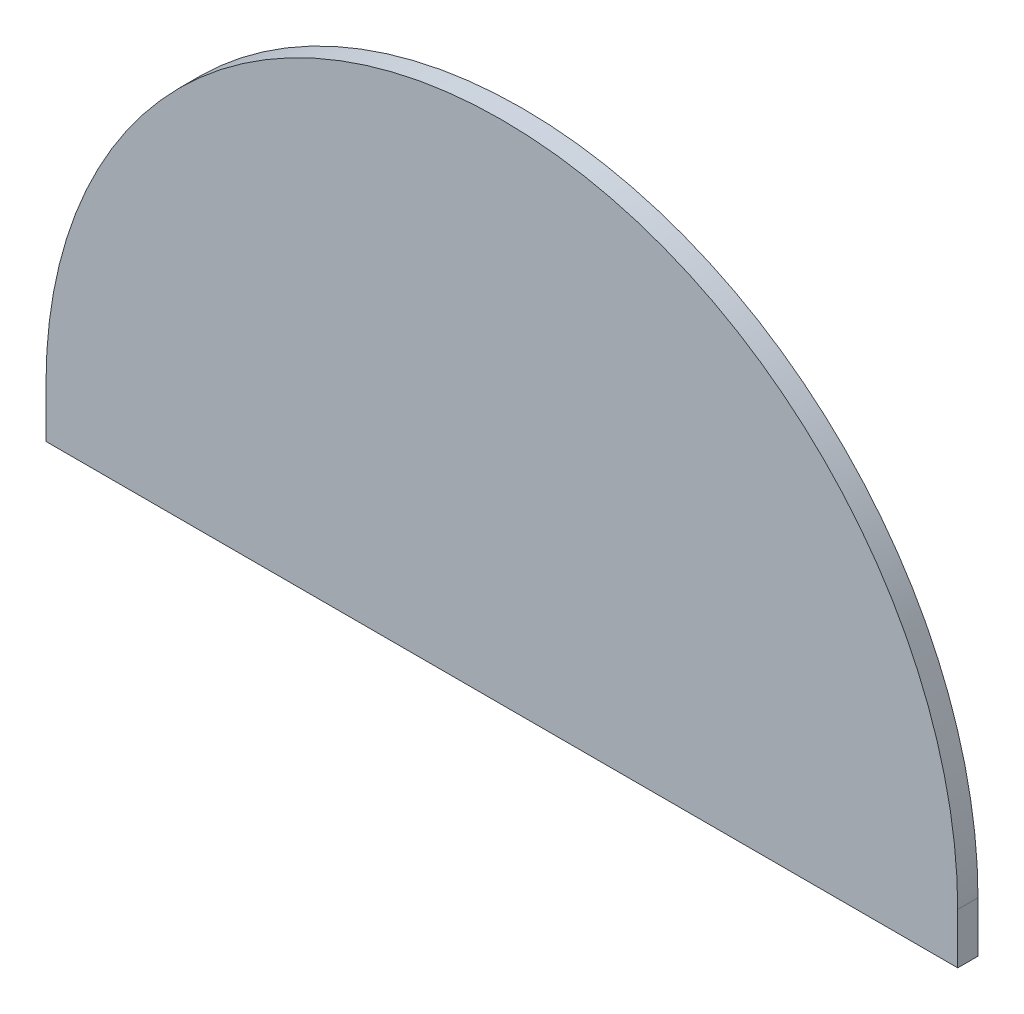
ISO-10303-21;
HEADER;
FILE_DESCRIPTION(('STEP AP214'),'2;1');
FILE_NAME('part.step','',(''),(''),'','','');
FILE_SCHEMA(('AUTOMOTIVE_DESIGN { 1 0 10303 214 1 1 1 1 }'));
ENDSEC;
DATA;
#1=APPLICATION_CONTEXT('core data for automotive mechanical design processes');
#2=APPLICATION_PROTOCOL_DEFINITION('international standard','automotive_design',2000,#1);
#3=PRODUCT_CONTEXT('',#1,'mechanical');
#4=PRODUCT('Part','Part','',(#3));
#5=PRODUCT_RELATED_PRODUCT_CATEGORY('part','',(#4));
#6=PRODUCT_DEFINITION_FORMATION('','',#4);
#7=PRODUCT_DEFINITION_CONTEXT('part definition',#1,'design');
#8=PRODUCT_DEFINITION('design','',#6,#7);
#9=PRODUCT_DEFINITION_SHAPE('','',#8);
#10=(LENGTH_UNIT() NAMED_UNIT(*) SI_UNIT(.MILLI.,.METRE.));
#11=(NAMED_UNIT(*) PLANE_ANGLE_UNIT() SI_UNIT($,.RADIAN.));
#12=(NAMED_UNIT(*) SI_UNIT($,.STERADIAN.) SOLID_ANGLE_UNIT());
#13=UNCERTAINTY_MEASURE_WITH_UNIT(LENGTH_MEASURE(1.E-05),#10,'distance_accuracy_value','');
#14=(GEOMETRIC_REPRESENTATION_CONTEXT(3) GLOBAL_UNCERTAINTY_ASSIGNED_CONTEXT((#13)) GLOBAL_UNIT_ASSIGNED_CONTEXT((#10,
#11,#12)) REPRESENTATION_CONTEXT('',''));
#15=CARTESIAN_POINT('',(0.,0.,0.));
#16=DIRECTION('',(0.,0.,1.));
#17=DIRECTION('',(1.,0.,0.));
#18=AXIS2_PLACEMENT_3D('',#15,#16,#17);
#19=CARTESIAN_POINT('',(0.,0.,2.));
#20=DIRECTION('',(0.,0.,-1.));
#21=DIRECTION('',(-1.,0.,0.));
#22=AXIS2_PLACEMENT_3D('',#19,#20,#21);
#23=CYLINDRICAL_SURFACE('',#22,45.);
#24=CARTESIAN_POINT('',(0.,0.,0.));
#25=DIRECTION('',(0.,0.,1.));
#26=DIRECTION('',(-1.,0.,0.));
#27=AXIS2_PLACEMENT_3D('',#24,#25,#26);
#28=CIRCLE('',#27,45.);
#29=CARTESIAN_POINT('',(45.,0.,0.));
#30=VERTEX_POINT('',#29);
#31=CARTESIAN_POINT('',(-45.,0.,0.));
#32=VERTEX_POINT('',#31);
#33=EDGE_CURVE('E89',#30,#32,#28,.T.);
#34=ORIENTED_EDGE('',*,*,#33,.T.);
#35=DIRECTION('',(0.,0.,-1.));
#36=VECTOR('',#35,1.);
#37=CARTESIAN_POINT('',(-45.,0.,2.));
#38=LINE('',#37,#36);
#39=CARTESIAN_POINT('',(-45.,0.,2.));
#40=VERTEX_POINT('',#39);
#41=EDGE_CURVE('E11',#40,#32,#38,.T.);
#42=ORIENTED_EDGE('',*,*,#41,.F.);
#43=CARTESIAN_POINT('',(0.,0.,2.));
#44=DIRECTION('',(0.,0.,1.));
#45=DIRECTION('',(-1.,0.,0.));
#46=AXIS2_PLACEMENT_3D('',#43,#44,#45);
#47=CIRCLE('',#46,45.);
#48=CARTESIAN_POINT('',(45.,0.,2.));
#49=VERTEX_POINT('',#48);
#50=EDGE_CURVE('E47',#49,#40,#47,.T.);
#51=ORIENTED_EDGE('',*,*,#50,.F.);
#52=DIRECTION('',(0.,0.,-1.));
#53=VECTOR('',#52,1.);
#54=CARTESIAN_POINT('',(45.,0.,2.));
#55=LINE('',#54,#53);
#56=EDGE_CURVE('E40',#49,#30,#55,.T.);
#57=ORIENTED_EDGE('',*,*,#56,.T.);
#58=EDGE_LOOP('',(#34,#42,#51,#57));
#59=FACE_BOUND('',#58,.T.);
#60=ADVANCED_FACE('F32',(#59),#23,.T.);
#61=CARTESIAN_POINT('',(0.,0.,2.));
#62=DIRECTION('',(0.,0.,-1.));
#63=DIRECTION('',(-1.,0.,0.));
#64=AXIS2_PLACEMENT_3D('',#61,#62,#63);
#65=PLANE('',#64);
#66=ORIENTED_EDGE('',*,*,#50,.T.);
#67=DIRECTION('',(0.,1.,0.));
#68=VECTOR('',#67,1.);
#69=CARTESIAN_POINT('',(-45.,-5.,1.99999999999999));
#70=LINE('',#69,#68);
#71=CARTESIAN_POINT('',(-45.,-5.,1.99999999999999));
#72=VERTEX_POINT('',#71);
#73=EDGE_CURVE('E74',#72,#40,#70,.T.);
#74=ORIENTED_EDGE('',*,*,#73,.F.);
#75=DIRECTION('',(-1.,0.,0.));
#76=VECTOR('',#75,1.);
#77=CARTESIAN_POINT('',(45.,-5.,2.));
#78=LINE('',#77,#76);
#79=CARTESIAN_POINT('',(45.,-5.,2.));
#80=VERTEX_POINT('',#79);
#81=EDGE_CURVE('E67',#80,#72,#78,.T.);
#82=ORIENTED_EDGE('',*,*,#81,.F.);
#83=DIRECTION('',(0.,1.,0.));
#84=VECTOR('',#83,1.);
#85=CARTESIAN_POINT('',(45.,-5.,2.));
#86=LINE('',#85,#84);
#87=EDGE_CURVE('E71',#80,#49,#86,.T.);
#88=ORIENTED_EDGE('',*,*,#87,.T.);
#89=EDGE_LOOP('',(#66,#74,#82,#88));
#90=FACE_BOUND('',#89,.T.);
#91=ADVANCED_FACE('F69',(#90),#65,.F.);
#92=CARTESIAN_POINT('',(0.,0.,0.));
#93=DIRECTION('',(0.,0.,-1.));
#94=DIRECTION('',(-1.,0.,0.));
#95=AXIS2_PLACEMENT_3D('',#92,#93,#94);
#96=PLANE('',#95);
#97=ORIENTED_EDGE('',*,*,#33,.F.);
#98=DIRECTION('',(0.,1.,0.));
#99=VECTOR('',#98,1.);
#100=CARTESIAN_POINT('',(45.,-5.,0.));
#101=LINE('',#100,#99);
#102=CARTESIAN_POINT('',(45.,-5.,0.));
#103=VERTEX_POINT('',#102);
#104=EDGE_CURVE('E97',#103,#30,#101,.T.);
#105=ORIENTED_EDGE('',*,*,#104,.F.);
#106=DIRECTION('',(1.,0.,0.));
#107=VECTOR('',#106,1.);
#108=CARTESIAN_POINT('',(45.,-5.,0.));
#109=LINE('',#108,#107);
#110=CARTESIAN_POINT('',(-45.,-5.,0.));
#111=VERTEX_POINT('',#110);
#112=EDGE_CURVE('E83',#111,#103,#109,.T.);
#113=ORIENTED_EDGE('',*,*,#112,.F.);
#114=DIRECTION('',(0.,1.,0.));
#115=VECTOR('',#114,1.);
#116=CARTESIAN_POINT('',(-45.,-5.,0.));
#117=LINE('',#116,#115);
#118=EDGE_CURVE('E93',#111,#32,#117,.T.);
#119=ORIENTED_EDGE('',*,*,#118,.T.);
#120=EDGE_LOOP('',(#97,#105,#113,#119));
#121=FACE_BOUND('',#120,.T.);
#122=ADVANCED_FACE('F106',(#121),#96,.T.);
#123=CARTESIAN_POINT('',(45.,-5.,2.));
#124=DIRECTION('',(-1.,0.,0.));
#125=DIRECTION('',(0.,0.,1.));
#126=AXIS2_PLACEMENT_3D('',#123,#124,#125);
#127=PLANE('',#126);
#128=ORIENTED_EDGE('',*,*,#56,.F.);
#129=ORIENTED_EDGE('',*,*,#87,.F.);
#130=DIRECTION('',(0.,0.,1.));
#131=VECTOR('',#130,1.);
#132=CARTESIAN_POINT('',(45.,-5.,2.));
#133=LINE('',#132,#131);
#134=EDGE_CURVE('E78',#103,#80,#133,.T.);
#135=ORIENTED_EDGE('',*,*,#134,.F.);
#136=ORIENTED_EDGE('',*,*,#104,.T.);
#137=EDGE_LOOP('',(#128,#129,#135,#136));
#138=FACE_BOUND('',#137,.T.);
#139=ADVANCED_FACE('F88',(#138),#127,.F.);
#140=CARTESIAN_POINT('',(-45.,-5.,1.99999999999999));
#141=DIRECTION('',(1.,0.,0.));
#142=DIRECTION('',(0.,0.,-1.));
#143=AXIS2_PLACEMENT_3D('',#140,#141,#142);
#144=PLANE('',#143);
#145=ORIENTED_EDGE('',*,*,#41,.T.);
#146=ORIENTED_EDGE('',*,*,#118,.F.);
#147=DIRECTION('',(0.,0.,-1.));
#148=VECTOR('',#147,1.);
#149=CARTESIAN_POINT('',(-45.,-5.,1.99999999999999));
#150=LINE('',#149,#148);
#151=EDGE_CURVE('E77',#72,#111,#150,.T.);
#152=ORIENTED_EDGE('',*,*,#151,.F.);
#153=ORIENTED_EDGE('',*,*,#73,.T.);
#154=EDGE_LOOP('',(#145,#146,#152,#153));
#155=FACE_BOUND('',#154,.T.);
#156=ADVANCED_FACE('F105',(#155),#144,.F.);
#157=CARTESIAN_POINT('',(0.,-5.,0.));
#158=DIRECTION('',(0.,1.,0.));
#159=DIRECTION('',(0.,0.,1.));
#160=AXIS2_PLACEMENT_3D('',#157,#158,#159);
#161=PLANE('',#160);
#162=ORIENTED_EDGE('',*,*,#134,.T.);
#163=ORIENTED_EDGE('',*,*,#81,.T.);
#164=ORIENTED_EDGE('',*,*,#151,.T.);
#165=ORIENTED_EDGE('',*,*,#112,.T.);
#166=EDGE_LOOP('',(#162,#163,#164,#165));
#167=FACE_BOUND('',#166,.T.);
#168=ADVANCED_FACE('F81',(#167),#161,.F.);
#169=CLOSED_SHELL('',(#60,#91,#122,#139,#156,#168));
#170=MANIFOLD_SOLID_BREP('B2',#169);
#171=ADVANCED_BREP_SHAPE_REPRESENTATION('',(#18,#170),#14);
#172=SHAPE_DEFINITION_REPRESENTATION(#9,#171);
ENDSEC;
END-ISO-10303-21;
